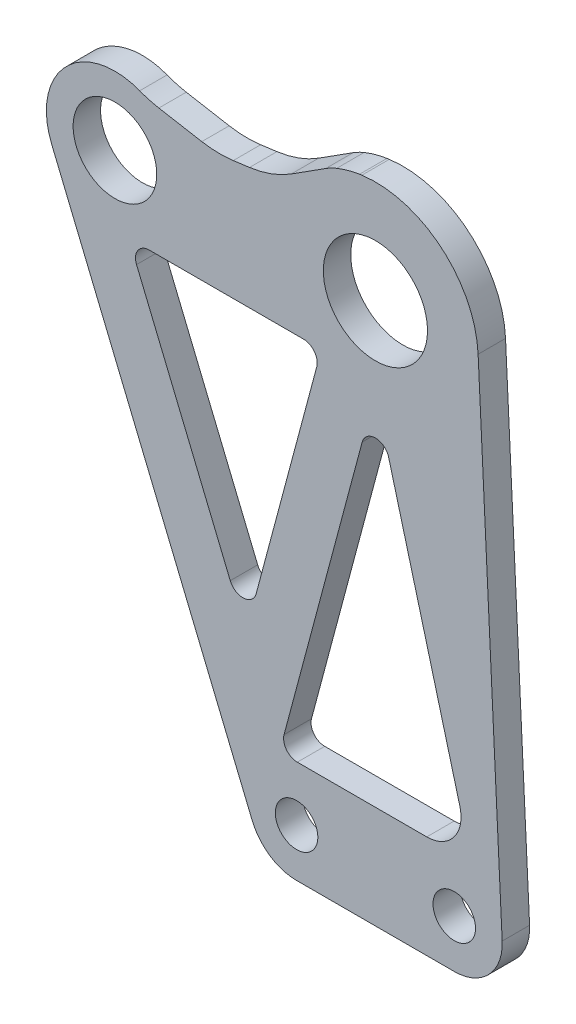
ISO-10303-21;
HEADER;
FILE_DESCRIPTION(('STEP AP214'),'2;1');
FILE_NAME('part.step','',(''),(''),'','','');
FILE_SCHEMA(('AUTOMOTIVE_DESIGN { 1 0 10303 214 1 1 1 1 }'));
ENDSEC;
DATA;
#1=APPLICATION_CONTEXT('core data for automotive mechanical design processes');
#2=APPLICATION_PROTOCOL_DEFINITION('international standard','automotive_design',2000,#1);
#3=PRODUCT_CONTEXT('',#1,'mechanical');
#4=PRODUCT('Part','Part','',(#3));
#5=PRODUCT_RELATED_PRODUCT_CATEGORY('part','',(#4));
#6=PRODUCT_DEFINITION_FORMATION('','',#4);
#7=PRODUCT_DEFINITION_CONTEXT('part definition',#1,'design');
#8=PRODUCT_DEFINITION('design','',#6,#7);
#9=PRODUCT_DEFINITION_SHAPE('','',#8);
#10=(LENGTH_UNIT() NAMED_UNIT(*) SI_UNIT(.MILLI.,.METRE.));
#11=(NAMED_UNIT(*) PLANE_ANGLE_UNIT() SI_UNIT($,.RADIAN.));
#12=(NAMED_UNIT(*) SI_UNIT($,.STERADIAN.) SOLID_ANGLE_UNIT());
#13=UNCERTAINTY_MEASURE_WITH_UNIT(LENGTH_MEASURE(1.E-05),#10,'distance_accuracy_value','');
#14=(GEOMETRIC_REPRESENTATION_CONTEXT(3) GLOBAL_UNCERTAINTY_ASSIGNED_CONTEXT((#13)) GLOBAL_UNIT_ASSIGNED_CONTEXT((#10,
#11,#12)) REPRESENTATION_CONTEXT('',''));
#15=CARTESIAN_POINT('',(0.,0.,0.));
#16=DIRECTION('',(0.,0.,1.));
#17=DIRECTION('',(1.,0.,0.));
#18=AXIS2_PLACEMENT_3D('',#15,#16,#17);
#19=CARTESIAN_POINT('',(-11.5,0.,4.));
#20=DIRECTION('',(0.,0.,1.));
#21=DIRECTION('',(1.,0.,0.));
#22=AXIS2_PLACEMENT_3D('',#19,#20,#21);
#23=PLANE('',#22);
#24=CARTESIAN_POINT('',(0.,72.,4.));
#25=DIRECTION('',(0.,0.,-1.));
#26=DIRECTION('',(1.,0.,0.));
#27=AXIS2_PLACEMENT_3D('',#24,#25,#26);
#28=CIRCLE('',#27,15.0037978079195);
#29=CARTESIAN_POINT('',(-5.64922242854932,85.899648722673,4.));
#30=VERTEX_POINT('',#29);
#31=CARTESIAN_POINT('',(-2.30831216147039,86.8251692612981,4.));
#32=VERTEX_POINT('',#31);
#33=EDGE_CURVE('E222',#30,#32,#28,.T.);
#34=ORIENTED_EDGE('',*,*,#33,.F.);
#35=CARTESIAN_POINT('',(-1.88402744200566,76.6355617890726,4.));
#36=DIRECTION('',(0.,0.,1.));
#37=DIRECTION('',(1.,0.,0.));
#38=AXIS2_PLACEMENT_3D('',#35,#36,#37);
#39=CIRCLE('',#38,10.);
#40=CARTESIAN_POINT('',(-7.2590241365421,85.06820138375,4.));
#41=VERTEX_POINT('',#40);
#42=EDGE_CURVE('E60',#30,#41,#39,.T.);
#43=ORIENTED_EDGE('',*,*,#42,.T.);
#44=DIRECTION('',(-0.843263959467748,-0.537499669453643,0.));
#45=VECTOR('',#44,1.);
#46=CARTESIAN_POINT('',(-6.69836822430438,85.4255656041956,4.));
#47=LINE('',#46,#45);
#48=CARTESIAN_POINT('',(-12.2752986193333,81.8708088637486,4.));
#49=VERTEX_POINT('',#48);
#50=EDGE_CURVE('E358',#41,#49,#47,.T.);
#51=ORIENTED_EDGE('',*,*,#50,.T.);
#52=CARTESIAN_POINT('',(-20.3377936611379,94.5197682557648,4.));
#53=DIRECTION('',(0.,0.,1.));
#54=DIRECTION('',(1.,0.,0.));
#55=AXIS2_PLACEMENT_3D('',#52,#53,#54);
#56=CIRCLE('',#55,15.);
#57=CARTESIAN_POINT('',(-18.3641094506116,79.6501828332616,4.));
#58=VERTEX_POINT('',#57);
#59=EDGE_CURVE('E388',#49,#58,#56,.F.);
#60=ORIENTED_EDGE('',*,*,#59,.T.);
#61=DIRECTION('',(0.991305694833545,0.131578947368421,0.));
#62=VECTOR('',#61,1.);
#63=CARTESIAN_POINT('',(-30.0729355904217,78.0960355844104,4.));
#64=LINE('',#63,#62);
#65=CARTESIAN_POINT('',(-20.7373696980855,79.3351729560649,4.));
#66=VERTEX_POINT('',#65);
#67=EDGE_CURVE('E231',#66,#58,#64,.T.);
#68=ORIENTED_EDGE('',*,*,#67,.F.);
#69=CARTESIAN_POINT('',(-22.7110539086118,94.204758378568,4.));
#70=DIRECTION('',(0.,0.,1.));
#71=DIRECTION('',(1.,0.,0.));
#72=AXIS2_PLACEMENT_3D('',#69,#70,#71);
#73=CIRCLE('',#72,15.);
#74=CARTESIAN_POINT('',(-25.3278901931516,79.4347831632904,4.));
#75=VERTEX_POINT('',#74);
#76=EDGE_CURVE('E382',#66,#75,#73,.F.);
#77=ORIENTED_EDGE('',*,*,#76,.T.);
#78=DIRECTION('',(0.984665014351843,-0.174455752302656,0.));
#79=VECTOR('',#78,1.);
#80=CARTESIAN_POINT('',(-23.0403436682235,79.0294923850897,4.));
#81=LINE('',#80,#79);
#82=CARTESIAN_POINT('',(-31.5938049647919,80.5449321575353,4.));
#83=VERTEX_POINT('',#82);
#84=EDGE_CURVE('E352',#75,#83,#81,.F.);
#85=ORIENTED_EDGE('',*,*,#84,.T.);
#86=CARTESIAN_POINT('',(-28.976968680252,95.3149073728129,4.));
#87=DIRECTION('',(0.,0.,1.));
#88=DIRECTION('',(1.,0.,0.));
#89=AXIS2_PLACEMENT_3D('',#86,#87,#88);
#90=CIRCLE('',#89,15.);
#91=CARTESIAN_POINT('',(-34.3907874721008,81.3259629491252,4.));
#92=VERTEX_POINT('',#91);
#93=EDGE_CURVE('E380',#83,#92,#90,.F.);
#94=ORIENTED_EDGE('',*,*,#93,.T.);
#95=CARTESIAN_POINT('',(-38.,72.,4.));
#96=DIRECTION('',(0.,0.,1.));
#97=DIRECTION('',(1.,0.,0.));
#98=AXIS2_PLACEMENT_3D('',#95,#96,#97);
#99=CIRCLE('',#98,10.);
#100=CARTESIAN_POINT('',(-47.2423056586954,68.1816513895079,4.));
#101=VERTEX_POINT('',#100);
#102=EDGE_CURVE('E246',#92,#101,#99,.T.);
#103=ORIENTED_EDGE('',*,*,#102,.T.);
#104=DIRECTION('',(0.381834861049206,-0.924230565869542,0.));
#105=VECTOR('',#104,1.);
#106=CARTESIAN_POINT('',(-47.2423056586954,68.1816513895079,4.));
#107=LINE('',#106,#105);
#108=CARTESIAN_POINT('',(-17.9696139610868,-2.67284402734444,4.));
#109=VERTEX_POINT('',#108);
#110=EDGE_CURVE('E248',#101,#109,#107,.T.);
#111=ORIENTED_EDGE('',*,*,#110,.T.);
#112=CARTESIAN_POINT('',(-11.5,0.,4.));
#113=DIRECTION('',(0.,0.,1.));
#114=DIRECTION('',(1.,0.,0.));
#115=AXIS2_PLACEMENT_3D('',#112,#113,#114);
#116=CIRCLE('',#115,7.);
#117=CARTESIAN_POINT('',(-11.5,-7.,4.));
#118=VERTEX_POINT('',#117);
#119=EDGE_CURVE('E273',#109,#118,#116,.T.);
#120=ORIENTED_EDGE('',*,*,#119,.T.);
#121=DIRECTION('',(1.,0.,0.));
#122=VECTOR('',#121,1.);
#123=CARTESIAN_POINT('',(-11.5,-7.,4.));
#124=LINE('',#123,#122);
#125=CARTESIAN_POINT('',(11.5,-7.,4.));
#126=VERTEX_POINT('',#125);
#127=EDGE_CURVE('E470',#118,#126,#124,.T.);
#128=ORIENTED_EDGE('',*,*,#127,.T.);
#129=CARTESIAN_POINT('',(11.5,0.,4.));
#130=DIRECTION('',(0.,0.,1.));
#131=DIRECTION('',(1.,0.,0.));
#132=AXIS2_PLACEMENT_3D('',#129,#130,#131);
#133=CIRCLE('',#132,7.);
#134=CARTESIAN_POINT('',(18.4917881788084,0.338966167448567,4.));
#135=VERTEX_POINT('',#134);
#136=EDGE_CURVE('E472',#126,#135,#133,.T.);
#137=ORIENTED_EDGE('',*,*,#136,.T.);
#138=DIRECTION('',(-0.0484237382069382,0.998826882686918,0.));
#139=VECTOR('',#138,1.);
#140=CARTESIAN_POINT('',(14.9824032403038,72.7263560731041,4.));
#141=LINE('',#140,#139);
#142=CARTESIAN_POINT('',(14.9824032403038,72.7263560731041,4.));
#143=VERTEX_POINT('',#142);
#144=EDGE_CURVE('E250',#135,#143,#141,.T.);
#145=ORIENTED_EDGE('',*,*,#144,.T.);
#146=CARTESIAN_POINT('',(0.,72.,4.));
#147=DIRECTION('',(0.,0.,1.));
#148=DIRECTION('',(1.,0.,0.));
#149=AXIS2_PLACEMENT_3D('',#146,#147,#148);
#150=CIRCLE('',#149,15.);
#151=CARTESIAN_POINT('',(-1.97368421052632,86.8695854225032,4.));
#152=VERTEX_POINT('',#151);
#153=EDGE_CURVE('E244',#143,#152,#150,.T.);
#154=ORIENTED_EDGE('',*,*,#153,.T.);
#155=DIRECTION('',(-0.991305694833545,-0.131578947368421,0.));
#156=VECTOR('',#155,1.);
#157=CARTESIAN_POINT('',(-39.3157894736842,81.9130569483355,4.));
#158=LINE('',#157,#156);
#159=EDGE_CURVE('E237',#152,#32,#158,.T.);
#160=ORIENTED_EDGE('',*,*,#159,.T.);
#161=EDGE_LOOP('',(#34,#43,#51,#60,#68,#77,#85,#94,#103,#111,#120,#128,#137,#145,#154,#160));
#162=FACE_BOUND('',#161,.T.);
#163=DIRECTION('',(0.381834861049206,-0.924230565869542,0.));
#164=VECTOR('',#163,1.);
#165=CARTESIAN_POINT('',(-18.9198788010047,20.5787359523555,4.));
#166=LINE('',#165,#164);
#167=CARTESIAN_POINT('',(-34.8494901072863,59.1363302779016,4.));
#168=VERTEX_POINT('',#167);
#169=CARTESIAN_POINT('',(-21.1756535351046,26.0388344704495,4.));
#170=VERTEX_POINT('',#169);
#171=EDGE_CURVE('E409',#168,#170,#166,.T.);
#172=ORIENTED_EDGE('',*,*,#171,.F.);
#173=CARTESIAN_POINT('',(-33.0010289755473,59.9,4.));
#174=DIRECTION('',(0.,0.,1.));
#175=DIRECTION('',(1.,0.,0.));
#176=AXIS2_PLACEMENT_3D('',#173,#174,#175);
#177=CIRCLE('',#176,2.);
#178=CARTESIAN_POINT('',(-33.0010289755473,61.9,4.));
#179=VERTEX_POINT('',#178);
#180=EDGE_CURVE('E323',#168,#179,#177,.F.);
#181=ORIENTED_EDGE('',*,*,#180,.T.);
#182=DIRECTION('',(-1.,0.,0.));
#183=VECTOR('',#182,1.);
#184=CARTESIAN_POINT('',(-35.9912673686027,61.9,4.));
#185=LINE('',#184,#183);
#186=CARTESIAN_POINT('',(-10.4843500120616,61.9,4.));
#187=VERTEX_POINT('',#186);
#188=EDGE_CURVE('E419',#187,#179,#185,.T.);
#189=ORIENTED_EDGE('',*,*,#188,.F.);
#190=CARTESIAN_POINT('',(-10.4843500120616,59.9,4.));
#191=DIRECTION('',(0.,0.,1.));
#192=DIRECTION('',(1.,0.,0.));
#193=AXIS2_PLACEMENT_3D('',#190,#191,#192);
#194=CIRCLE('',#193,2.);
#195=CARTESIAN_POINT('',(-8.55212516101198,59.3837567191852,4.));
#196=VERTEX_POINT('',#195);
#197=EDGE_CURVE('E319',#187,#196,#194,.F.);
#198=ORIENTED_EDGE('',*,*,#197,.T.);
#199=DIRECTION('',(0.258121640407387,0.966112425524793,0.));
#200=VECTOR('',#199,1.);
#201=CARTESIAN_POINT('',(-7.87984642186299,61.9,4.));
#202=LINE('',#201,#200);
#203=CARTESIAN_POINT('',(-17.394967552316,26.2862609117332,4.));
#204=VERTEX_POINT('',#203);
#205=EDGE_CURVE('E412',#204,#196,#202,.T.);
#206=ORIENTED_EDGE('',*,*,#205,.F.);
#207=CARTESIAN_POINT('',(-19.3271924033655,26.8025041925479,4.));
#208=DIRECTION('',(0.,0.,1.));
#209=DIRECTION('',(1.,0.,0.));
#210=AXIS2_PLACEMENT_3D('',#207,#208,#209);
#211=CIRCLE('',#210,2.);
#212=EDGE_CURVE('E327',#204,#170,#211,.F.);
#213=ORIENTED_EDGE('',*,*,#212,.T.);
#214=EDGE_LOOP('',(#172,#181,#189,#198,#206,#213));
#215=FACE_BOUND('',#214,.T.);
#216=DIRECTION('',(-0.258121640407388,0.966112425524793,0.));
#217=VECTOR('',#216,1.);
#218=CARTESIAN_POINT('',(14.,8.00000000000001,4.));
#219=LINE('',#218,#217);
#220=CARTESIAN_POINT('',(12.3193031521275,14.290608202037,4.));
#221=VERTEX_POINT('',#220);
#222=CARTESIAN_POINT('',(1.93222485104958,53.167958414643,4.));
#223=VERTEX_POINT('',#222);
#224=EDGE_CURVE('E424',#221,#223,#219,.T.);
#225=ORIENTED_EDGE('',*,*,#224,.F.);
#226=CARTESIAN_POINT('',(7.48874102450357,13.,4.));
#227=DIRECTION('',(0.,0.,1.));
#228=DIRECTION('',(1.,0.,0.));
#229=AXIS2_PLACEMENT_3D('',#226,#227,#228);
#230=CIRCLE('',#229,5.);
#231=CARTESIAN_POINT('',(7.48874102450357,8.00000000000001,4.));
#232=VERTEX_POINT('',#231);
#233=EDGE_CURVE('E345',#221,#232,#230,.F.);
#234=ORIENTED_EDGE('',*,*,#233,.T.);
#235=DIRECTION('',(1.,0.,0.));
#236=VECTOR('',#235,1.);
#237=CARTESIAN_POINT('',(-14.,8.00000000000001,4.));
#238=LINE('',#237,#236);
#239=CARTESIAN_POINT('',(-11.3954964098014,8.00000000000001,4.));
#240=VERTEX_POINT('',#239);
#241=EDGE_CURVE('E433',#240,#232,#238,.T.);
#242=ORIENTED_EDGE('',*,*,#241,.F.);
#243=CARTESIAN_POINT('',(-11.3954964098014,10.,4.));
#244=DIRECTION('',(0.,0.,1.));
#245=DIRECTION('',(1.,0.,0.));
#246=AXIS2_PLACEMENT_3D('',#243,#244,#245);
#247=CIRCLE('',#246,2.);
#248=CARTESIAN_POINT('',(-13.327721260851,10.5162432808148,4.));
#249=VERTEX_POINT('',#248);
#250=EDGE_CURVE('E331',#240,#249,#247,.F.);
#251=ORIENTED_EDGE('',*,*,#250,.T.);
#252=DIRECTION('',(-0.258121640407387,-0.966112425524793,0.));
#253=VECTOR('',#252,1.);
#254=CARTESIAN_POINT('',(0.,60.4,4.));
#255=LINE('',#254,#253);
#256=CARTESIAN_POINT('',(-1.93222485104959,53.167958414643,4.));
#257=VERTEX_POINT('',#256);
#258=EDGE_CURVE('E441',#257,#249,#255,.T.);
#259=ORIENTED_EDGE('',*,*,#258,.F.);
#260=CARTESIAN_POINT('',(0.,52.6517151338282,4.));
#261=DIRECTION('',(0.,0.,1.));
#262=DIRECTION('',(1.,0.,0.));
#263=AXIS2_PLACEMENT_3D('',#260,#261,#262);
#264=CIRCLE('',#263,2.);
#265=EDGE_CURVE('E335',#257,#223,#264,.F.);
#266=ORIENTED_EDGE('',*,*,#265,.T.);
#267=EDGE_LOOP('',(#225,#234,#242,#251,#259,#266));
#268=FACE_BOUND('',#267,.T.);
#269=CARTESIAN_POINT('',(0.,72.,4.));
#270=DIRECTION('',(0.,0.,1.));
#271=DIRECTION('',(1.,0.,0.));
#272=AXIS2_PLACEMENT_3D('',#269,#270,#271);
#273=CIRCLE('',#272,7.6);
#274=CARTESIAN_POINT('',(7.6,72.,4.));
#275=VERTEX_POINT('',#274);
#276=EDGE_CURVE('E452',#275,#275,#273,.T.);
#277=ORIENTED_EDGE('',*,*,#276,.F.);
#278=EDGE_LOOP('',(#277));
#279=FACE_BOUND('',#278,.T.);
#280=CARTESIAN_POINT('',(-11.5,0.,4.));
#281=DIRECTION('',(0.,0.,1.));
#282=DIRECTION('',(1.,0.,0.));
#283=AXIS2_PLACEMENT_3D('',#280,#281,#282);
#284=CIRCLE('',#283,3.1);
#285=CARTESIAN_POINT('',(-8.4,0.,4.));
#286=VERTEX_POINT('',#285);
#287=EDGE_CURVE('E260',#286,#286,#284,.T.);
#288=ORIENTED_EDGE('',*,*,#287,.F.);
#289=EDGE_LOOP('',(#288));
#290=FACE_BOUND('',#289,.T.);
#291=CARTESIAN_POINT('',(11.5,0.,4.));
#292=DIRECTION('',(0.,0.,1.));
#293=DIRECTION('',(1.,0.,0.));
#294=AXIS2_PLACEMENT_3D('',#291,#292,#293);
#295=CIRCLE('',#294,3.1);
#296=CARTESIAN_POINT('',(14.6,0.,4.));
#297=VERTEX_POINT('',#296);
#298=EDGE_CURVE('E458',#297,#297,#295,.T.);
#299=ORIENTED_EDGE('',*,*,#298,.F.);
#300=EDGE_LOOP('',(#299));
#301=FACE_BOUND('',#300,.T.);
#302=CARTESIAN_POINT('',(-38.,72.,4.));
#303=DIRECTION('',(0.,0.,1.));
#304=DIRECTION('',(1.,0.,0.));
#305=AXIS2_PLACEMENT_3D('',#302,#303,#304);
#306=CIRCLE('',#305,6.1);
#307=CARTESIAN_POINT('',(-31.9,72.,4.));
#308=VERTEX_POINT('',#307);
#309=EDGE_CURVE('E446',#308,#308,#306,.T.);
#310=ORIENTED_EDGE('',*,*,#309,.F.);
#311=EDGE_LOOP('',(#310));
#312=FACE_BOUND('',#311,.T.);
#313=ADVANCED_FACE('F38',(#162,#215,#268,#279,#290,#301,#312),#23,.T.);
#314=CARTESIAN_POINT('',(-11.5,0.,0.));
#315=DIRECTION('',(0.,0.,1.));
#316=DIRECTION('',(1.,0.,0.));
#317=AXIS2_PLACEMENT_3D('',#314,#315,#316);
#318=PLANE('',#317);
#319=DIRECTION('',(0.258121640407387,0.966112425524793,0.));
#320=VECTOR('',#319,1.);
#321=CARTESIAN_POINT('',(-7.87984642186299,61.9,0.));
#322=LINE('',#321,#320);
#323=CARTESIAN_POINT('',(-17.394967552316,26.2862609117332,0.));
#324=VERTEX_POINT('',#323);
#325=CARTESIAN_POINT('',(-8.55212516101198,59.3837567191852,0.));
#326=VERTEX_POINT('',#325);
#327=EDGE_CURVE('E418',#324,#326,#322,.T.);
#328=ORIENTED_EDGE('',*,*,#327,.T.);
#329=CARTESIAN_POINT('',(-10.4843500120616,59.9,0.));
#330=DIRECTION('',(0.,0.,1.));
#331=DIRECTION('',(1.,0.,0.));
#332=AXIS2_PLACEMENT_3D('',#329,#330,#331);
#333=CIRCLE('',#332,2.);
#334=CARTESIAN_POINT('',(-10.4843500120616,61.9,0.));
#335=VERTEX_POINT('',#334);
#336=EDGE_CURVE('E321',#326,#335,#333,.T.);
#337=ORIENTED_EDGE('',*,*,#336,.T.);
#338=DIRECTION('',(-1.,0.,0.));
#339=VECTOR('',#338,1.);
#340=CARTESIAN_POINT('',(-35.9912673686027,61.9,0.));
#341=LINE('',#340,#339);
#342=CARTESIAN_POINT('',(-33.0010289755473,61.9,0.));
#343=VERTEX_POINT('',#342);
#344=EDGE_CURVE('E422',#335,#343,#341,.T.);
#345=ORIENTED_EDGE('',*,*,#344,.T.);
#346=CARTESIAN_POINT('',(-33.0010289755473,59.9,0.));
#347=DIRECTION('',(0.,0.,1.));
#348=DIRECTION('',(1.,0.,0.));
#349=AXIS2_PLACEMENT_3D('',#346,#347,#348);
#350=CIRCLE('',#349,2.);
#351=CARTESIAN_POINT('',(-34.8494901072863,59.1363302779016,0.));
#352=VERTEX_POINT('',#351);
#353=EDGE_CURVE('E325',#343,#352,#350,.T.);
#354=ORIENTED_EDGE('',*,*,#353,.T.);
#355=DIRECTION('',(0.381834861049206,-0.924230565869542,0.));
#356=VECTOR('',#355,1.);
#357=CARTESIAN_POINT('',(-18.9198788010047,20.5787359523555,0.));
#358=LINE('',#357,#356);
#359=CARTESIAN_POINT('',(-21.1756535351046,26.0388344704495,0.));
#360=VERTEX_POINT('',#359);
#361=EDGE_CURVE('E415',#352,#360,#358,.T.);
#362=ORIENTED_EDGE('',*,*,#361,.T.);
#363=CARTESIAN_POINT('',(-19.3271924033655,26.8025041925479,0.));
#364=DIRECTION('',(0.,0.,1.));
#365=DIRECTION('',(1.,0.,0.));
#366=AXIS2_PLACEMENT_3D('',#363,#364,#365);
#367=CIRCLE('',#366,2.);
#368=EDGE_CURVE('E329',#360,#324,#367,.T.);
#369=ORIENTED_EDGE('',*,*,#368,.T.);
#370=EDGE_LOOP('',(#328,#337,#345,#354,#362,#369));
#371=FACE_BOUND('',#370,.T.);
#372=DIRECTION('',(-0.258121640407387,-0.966112425524793,0.));
#373=VECTOR('',#372,1.);
#374=CARTESIAN_POINT('',(0.,60.4,0.));
#375=LINE('',#374,#373);
#376=CARTESIAN_POINT('',(-1.93222485104959,53.167958414643,0.));
#377=VERTEX_POINT('',#376);
#378=CARTESIAN_POINT('',(-13.327721260851,10.5162432808148,0.));
#379=VERTEX_POINT('',#378);
#380=EDGE_CURVE('E432',#377,#379,#375,.T.);
#381=ORIENTED_EDGE('',*,*,#380,.T.);
#382=CARTESIAN_POINT('',(-11.3954964098014,10.,0.));
#383=DIRECTION('',(0.,0.,1.));
#384=DIRECTION('',(1.,0.,0.));
#385=AXIS2_PLACEMENT_3D('',#382,#383,#384);
#386=CIRCLE('',#385,2.);
#387=CARTESIAN_POINT('',(-11.3954964098014,8.00000000000001,0.));
#388=VERTEX_POINT('',#387);
#389=EDGE_CURVE('E333',#379,#388,#386,.T.);
#390=ORIENTED_EDGE('',*,*,#389,.T.);
#391=DIRECTION('',(1.,0.,0.));
#392=VECTOR('',#391,1.);
#393=CARTESIAN_POINT('',(-14.,8.00000000000001,0.));
#394=LINE('',#393,#392);
#395=CARTESIAN_POINT('',(7.48874102450357,8.00000000000001,0.));
#396=VERTEX_POINT('',#395);
#397=EDGE_CURVE('E436',#388,#396,#394,.T.);
#398=ORIENTED_EDGE('',*,*,#397,.T.);
#399=CARTESIAN_POINT('',(7.48874102450357,13.,0.));
#400=DIRECTION('',(0.,0.,1.));
#401=DIRECTION('',(1.,0.,0.));
#402=AXIS2_PLACEMENT_3D('',#399,#400,#401);
#403=CIRCLE('',#402,5.);
#404=CARTESIAN_POINT('',(12.3193031521275,14.290608202037,0.));
#405=VERTEX_POINT('',#404);
#406=EDGE_CURVE('E347',#396,#405,#403,.T.);
#407=ORIENTED_EDGE('',*,*,#406,.T.);
#408=DIRECTION('',(-0.258121640407388,0.966112425524793,0.));
#409=VECTOR('',#408,1.);
#410=CARTESIAN_POINT('',(14.,8.00000000000001,0.));
#411=LINE('',#410,#409);
#412=CARTESIAN_POINT('',(1.93222485104958,53.167958414643,0.));
#413=VERTEX_POINT('',#412);
#414=EDGE_CURVE('E430',#405,#413,#411,.T.);
#415=ORIENTED_EDGE('',*,*,#414,.T.);
#416=CARTESIAN_POINT('',(0.,52.6517151338282,0.));
#417=DIRECTION('',(0.,0.,1.));
#418=DIRECTION('',(1.,0.,0.));
#419=AXIS2_PLACEMENT_3D('',#416,#417,#418);
#420=CIRCLE('',#419,2.);
#421=EDGE_CURVE('E338',#413,#377,#420,.T.);
#422=ORIENTED_EDGE('',*,*,#421,.T.);
#423=EDGE_LOOP('',(#381,#390,#398,#407,#415,#422));
#424=FACE_BOUND('',#423,.T.);
#425=DIRECTION('',(0.843263959467748,0.537499669453643,0.));
#426=VECTOR('',#425,1.);
#427=CARTESIAN_POINT('',(-48.8322680861663,58.5692568597331,0.));
#428=LINE('',#427,#426);
#429=CARTESIAN_POINT('',(-12.2752986193333,81.8708088637485,0.));
#430=VERTEX_POINT('',#429);
#431=CARTESIAN_POINT('',(-7.2590241365421,85.06820138375,0.));
#432=VERTEX_POINT('',#431);
#433=EDGE_CURVE('E360',#430,#432,#428,.T.);
#434=ORIENTED_EDGE('',*,*,#433,.T.);
#435=CARTESIAN_POINT('',(-1.88402744200566,76.6355617890726,0.));
#436=DIRECTION('',(0.,0.,1.));
#437=DIRECTION('',(1.,0.,0.));
#438=AXIS2_PLACEMENT_3D('',#435,#436,#437);
#439=CIRCLE('',#438,10.);
#440=CARTESIAN_POINT('',(-5.64922242854932,85.899648722673,0.));
#441=VERTEX_POINT('',#440);
#442=EDGE_CURVE('E11',#432,#441,#439,.F.);
#443=ORIENTED_EDGE('',*,*,#442,.T.);
#444=CARTESIAN_POINT('',(0.,72.,0.));
#445=DIRECTION('',(0.,0.,1.));
#446=DIRECTION('',(1.,0.,0.));
#447=AXIS2_PLACEMENT_3D('',#444,#445,#446);
#448=CIRCLE('',#447,15.0037978079195);
#449=CARTESIAN_POINT('',(-2.30831216147039,86.8251692612981,0.));
#450=VERTEX_POINT('',#449);
#451=EDGE_CURVE('E240',#441,#450,#448,.F.);
#452=ORIENTED_EDGE('',*,*,#451,.T.);
#453=DIRECTION('',(-0.991305694833545,-0.131578947368421,0.));
#454=VECTOR('',#453,1.);
#455=CARTESIAN_POINT('',(-39.3157894736842,81.9130569483355,0.));
#456=LINE('',#455,#454);
#457=CARTESIAN_POINT('',(-1.97368421052632,86.8695854225032,0.));
#458=VERTEX_POINT('',#457);
#459=EDGE_CURVE('E239',#458,#450,#456,.T.);
#460=ORIENTED_EDGE('',*,*,#459,.F.);
#461=CARTESIAN_POINT('',(0.,72.,0.));
#462=DIRECTION('',(0.,0.,1.));
#463=DIRECTION('',(1.,0.,0.));
#464=AXIS2_PLACEMENT_3D('',#461,#462,#463);
#465=CIRCLE('',#464,15.);
#466=CARTESIAN_POINT('',(14.9824032403038,72.7263560731041,0.));
#467=VERTEX_POINT('',#466);
#468=EDGE_CURVE('E266',#467,#458,#465,.T.);
#469=ORIENTED_EDGE('',*,*,#468,.F.);
#470=DIRECTION('',(-0.0484237382069382,0.998826882686918,0.));
#471=VECTOR('',#470,1.);
#472=CARTESIAN_POINT('',(14.9824032403038,72.7263560731041,0.));
#473=LINE('',#472,#471);
#474=CARTESIAN_POINT('',(18.4917881788084,0.338966167448567,0.));
#475=VERTEX_POINT('',#474);
#476=EDGE_CURVE('E264',#475,#467,#473,.T.);
#477=ORIENTED_EDGE('',*,*,#476,.F.);
#478=CARTESIAN_POINT('',(11.5,0.,0.));
#479=DIRECTION('',(0.,0.,1.));
#480=DIRECTION('',(1.,0.,0.));
#481=AXIS2_PLACEMENT_3D('',#478,#479,#480);
#482=CIRCLE('',#481,7.);
#483=CARTESIAN_POINT('',(11.5,-7.,0.));
#484=VERTEX_POINT('',#483);
#485=EDGE_CURVE('E262',#484,#475,#482,.T.);
#486=ORIENTED_EDGE('',*,*,#485,.F.);
#487=DIRECTION('',(1.,0.,0.));
#488=VECTOR('',#487,1.);
#489=CARTESIAN_POINT('',(-11.5,-7.,0.));
#490=LINE('',#489,#488);
#491=CARTESIAN_POINT('',(-11.5,-7.,0.));
#492=VERTEX_POINT('',#491);
#493=EDGE_CURVE('E259',#492,#484,#490,.T.);
#494=ORIENTED_EDGE('',*,*,#493,.F.);
#495=CARTESIAN_POINT('',(-11.5,0.,0.));
#496=DIRECTION('',(0.,0.,1.));
#497=DIRECTION('',(1.,0.,0.));
#498=AXIS2_PLACEMENT_3D('',#495,#496,#497);
#499=CIRCLE('',#498,7.);
#500=CARTESIAN_POINT('',(-17.9696139610868,-2.67284402734444,0.));
#501=VERTEX_POINT('',#500);
#502=EDGE_CURVE('E256',#501,#492,#499,.T.);
#503=ORIENTED_EDGE('',*,*,#502,.F.);
#504=DIRECTION('',(0.381834861049206,-0.924230565869542,0.));
#505=VECTOR('',#504,1.);
#506=CARTESIAN_POINT('',(-47.2423056586954,68.1816513895079,0.));
#507=LINE('',#506,#505);
#508=CARTESIAN_POINT('',(-47.2423056586954,68.1816513895079,0.));
#509=VERTEX_POINT('',#508);
#510=EDGE_CURVE('E271',#509,#501,#507,.T.);
#511=ORIENTED_EDGE('',*,*,#510,.F.);
#512=CARTESIAN_POINT('',(-38.,72.,0.));
#513=DIRECTION('',(0.,0.,1.));
#514=DIRECTION('',(1.,0.,0.));
#515=AXIS2_PLACEMENT_3D('',#512,#513,#514);
#516=CIRCLE('',#515,10.);
#517=CARTESIAN_POINT('',(-34.3907874721008,81.3259629491252,0.));
#518=VERTEX_POINT('',#517);
#519=EDGE_CURVE('E269',#518,#509,#516,.T.);
#520=ORIENTED_EDGE('',*,*,#519,.F.);
#521=CARTESIAN_POINT('',(-28.976968680252,95.3149073728129,0.));
#522=DIRECTION('',(0.,0.,1.));
#523=DIRECTION('',(1.,0.,0.));
#524=AXIS2_PLACEMENT_3D('',#521,#522,#523);
#525=CIRCLE('',#524,15.);
#526=CARTESIAN_POINT('',(-31.5938049647919,80.5449321575353,0.));
#527=VERTEX_POINT('',#526);
#528=EDGE_CURVE('E378',#518,#527,#525,.T.);
#529=ORIENTED_EDGE('',*,*,#528,.T.);
#530=DIRECTION('',(-0.984665014351843,0.174455752302656,0.));
#531=VECTOR('',#530,1.);
#532=CARTESIAN_POINT('',(1.72449564644871,74.6418391118195,0.));
#533=LINE('',#532,#531);
#534=CARTESIAN_POINT('',(-25.3278901931516,79.4347831632904,0.));
#535=VERTEX_POINT('',#534);
#536=EDGE_CURVE('E355',#527,#535,#533,.F.);
#537=ORIENTED_EDGE('',*,*,#536,.T.);
#538=CARTESIAN_POINT('',(-22.7110539086118,94.204758378568,0.));
#539=DIRECTION('',(0.,0.,1.));
#540=DIRECTION('',(1.,0.,0.));
#541=AXIS2_PLACEMENT_3D('',#538,#539,#540);
#542=CIRCLE('',#541,15.);
#543=CARTESIAN_POINT('',(-20.7373696980855,79.3351729560649,0.));
#544=VERTEX_POINT('',#543);
#545=EDGE_CURVE('E384',#535,#544,#542,.T.);
#546=ORIENTED_EDGE('',*,*,#545,.T.);
#547=DIRECTION('',(0.991305694833545,0.131578947368421,0.));
#548=VECTOR('',#547,1.);
#549=CARTESIAN_POINT('',(-22.0080068596419,79.1665175139786,0.));
#550=LINE('',#549,#548);
#551=CARTESIAN_POINT('',(-18.3641094506116,79.6501828332616,0.));
#552=VERTEX_POINT('',#551);
#553=EDGE_CURVE('E349',#544,#552,#550,.T.);
#554=ORIENTED_EDGE('',*,*,#553,.T.);
#555=CARTESIAN_POINT('',(-20.3377936611379,94.5197682557648,0.));
#556=DIRECTION('',(0.,0.,1.));
#557=DIRECTION('',(1.,0.,0.));
#558=AXIS2_PLACEMENT_3D('',#555,#556,#557);
#559=CIRCLE('',#558,15.);
#560=EDGE_CURVE('E386',#552,#430,#559,.T.);
#561=ORIENTED_EDGE('',*,*,#560,.T.);
#562=EDGE_LOOP('',(#434,#443,#452,#460,#469,#477,#486,#494,#503,#511,#520,#529,#537,#546,#554,#561));
#563=FACE_BOUND('',#562,.T.);
#564=CARTESIAN_POINT('',(-11.5,0.,0.));
#565=DIRECTION('',(0.,0.,1.));
#566=DIRECTION('',(1.,0.,0.));
#567=AXIS2_PLACEMENT_3D('',#564,#565,#566);
#568=CIRCLE('',#567,3.1);
#569=CARTESIAN_POINT('',(-8.4,0.,0.));
#570=VERTEX_POINT('',#569);
#571=EDGE_CURVE('E461',#570,#570,#568,.T.);
#572=ORIENTED_EDGE('',*,*,#571,.T.);
#573=EDGE_LOOP('',(#572));
#574=FACE_BOUND('',#573,.T.);
#575=CARTESIAN_POINT('',(11.5,0.,0.));
#576=DIRECTION('',(0.,0.,1.));
#577=DIRECTION('',(1.,0.,0.));
#578=AXIS2_PLACEMENT_3D('',#575,#576,#577);
#579=CIRCLE('',#578,3.1);
#580=CARTESIAN_POINT('',(14.6,0.,0.));
#581=VERTEX_POINT('',#580);
#582=EDGE_CURVE('E455',#581,#581,#579,.T.);
#583=ORIENTED_EDGE('',*,*,#582,.T.);
#584=EDGE_LOOP('',(#583));
#585=FACE_BOUND('',#584,.T.);
#586=CARTESIAN_POINT('',(0.,72.,0.));
#587=DIRECTION('',(0.,0.,1.));
#588=DIRECTION('',(1.,0.,0.));
#589=AXIS2_PLACEMENT_3D('',#586,#587,#588);
#590=CIRCLE('',#589,7.6);
#591=CARTESIAN_POINT('',(7.6,72.,0.));
#592=VERTEX_POINT('',#591);
#593=EDGE_CURVE('E449',#592,#592,#590,.T.);
#594=ORIENTED_EDGE('',*,*,#593,.T.);
#595=EDGE_LOOP('',(#594));
#596=FACE_BOUND('',#595,.T.);
#597=CARTESIAN_POINT('',(-38.,72.,0.));
#598=DIRECTION('',(0.,0.,1.));
#599=DIRECTION('',(1.,0.,0.));
#600=AXIS2_PLACEMENT_3D('',#597,#598,#599);
#601=CIRCLE('',#600,6.1);
#602=CARTESIAN_POINT('',(-31.9,72.,0.));
#603=VERTEX_POINT('',#602);
#604=EDGE_CURVE('E439',#603,#603,#601,.T.);
#605=ORIENTED_EDGE('',*,*,#604,.T.);
#606=EDGE_LOOP('',(#605));
#607=FACE_BOUND('',#606,.T.);
#608=ADVANCED_FACE('F404',(#371,#424,#563,#574,#585,#596,#607),#318,.F.);
#609=CARTESIAN_POINT('',(-11.5,0.,4.));
#610=DIRECTION('',(0.,0.,-1.));
#611=DIRECTION('',(-1.,0.,0.));
#612=AXIS2_PLACEMENT_3D('',#609,#610,#611);
#613=CYLINDRICAL_SURFACE('',#612,7.);
#614=ORIENTED_EDGE('',*,*,#502,.T.);
#615=DIRECTION('',(0.,0.,-1.));
#616=VECTOR('',#615,1.);
#617=CARTESIAN_POINT('',(-11.5,-7.,4.));
#618=LINE('',#617,#616);
#619=EDGE_CURVE('E290',#118,#492,#618,.T.);
#620=ORIENTED_EDGE('',*,*,#619,.F.);
#621=ORIENTED_EDGE('',*,*,#119,.F.);
#622=DIRECTION('',(0.,0.,-1.));
#623=VECTOR('',#622,1.);
#624=CARTESIAN_POINT('',(-17.9696139610868,-2.67284402734444,4.));
#625=LINE('',#624,#623);
#626=EDGE_CURVE('E255',#109,#501,#625,.T.);
#627=ORIENTED_EDGE('',*,*,#626,.T.);
#628=EDGE_LOOP('',(#614,#620,#621,#627));
#629=FACE_BOUND('',#628,.T.);
#630=ADVANCED_FACE('F493',(#629),#613,.T.);
#631=CARTESIAN_POINT('',(-11.5,-7.,4.));
#632=DIRECTION('',(0.,1.,0.));
#633=DIRECTION('',(-1.,0.,0.));
#634=AXIS2_PLACEMENT_3D('',#631,#632,#633);
#635=PLANE('',#634);
#636=ORIENTED_EDGE('',*,*,#493,.T.);
#637=DIRECTION('',(0.,0.,-1.));
#638=VECTOR('',#637,1.);
#639=CARTESIAN_POINT('',(11.5,-7.,4.));
#640=LINE('',#639,#638);
#641=EDGE_CURVE('E287',#126,#484,#640,.T.);
#642=ORIENTED_EDGE('',*,*,#641,.F.);
#643=ORIENTED_EDGE('',*,*,#127,.F.);
#644=ORIENTED_EDGE('',*,*,#619,.T.);
#645=EDGE_LOOP('',(#636,#642,#643,#644));
#646=FACE_BOUND('',#645,.T.);
#647=ADVANCED_FACE('F489',(#646),#635,.F.);
#648=CARTESIAN_POINT('',(11.5,0.,4.));
#649=DIRECTION('',(0.,0.,-1.));
#650=DIRECTION('',(-1.,0.,0.));
#651=AXIS2_PLACEMENT_3D('',#648,#649,#650);
#652=CYLINDRICAL_SURFACE('',#651,7.);
#653=ORIENTED_EDGE('',*,*,#485,.T.);
#654=DIRECTION('',(0.,0.,-1.));
#655=VECTOR('',#654,1.);
#656=CARTESIAN_POINT('',(18.4917881788084,0.338966167448567,4.));
#657=LINE('',#656,#655);
#658=EDGE_CURVE('E284',#135,#475,#657,.T.);
#659=ORIENTED_EDGE('',*,*,#658,.F.);
#660=ORIENTED_EDGE('',*,*,#136,.F.);
#661=ORIENTED_EDGE('',*,*,#641,.T.);
#662=EDGE_LOOP('',(#653,#659,#660,#661));
#663=FACE_BOUND('',#662,.T.);
#664=ADVANCED_FACE('F486',(#663),#652,.T.);
#665=CARTESIAN_POINT('',(14.9824032403038,72.7263560731041,4.));
#666=DIRECTION('',(-0.998826882686918,-0.0484237382069382,0.));
#667=DIRECTION('',(0.0484237382069382,-0.998826882686918,0.));
#668=AXIS2_PLACEMENT_3D('',#665,#666,#667);
#669=PLANE('',#668);
#670=ORIENTED_EDGE('',*,*,#476,.T.);
#671=DIRECTION('',(0.,0.,-1.));
#672=VECTOR('',#671,1.);
#673=CARTESIAN_POINT('',(14.9824032403038,72.7263560731041,4.));
#674=LINE('',#673,#672);
#675=EDGE_CURVE('E281',#143,#467,#674,.T.);
#676=ORIENTED_EDGE('',*,*,#675,.F.);
#677=ORIENTED_EDGE('',*,*,#144,.F.);
#678=ORIENTED_EDGE('',*,*,#658,.T.);
#679=EDGE_LOOP('',(#670,#676,#677,#678));
#680=FACE_BOUND('',#679,.T.);
#681=ADVANCED_FACE('F478',(#680),#669,.F.);
#682=CARTESIAN_POINT('',(0.,72.,4.));
#683=DIRECTION('',(0.,0.,-1.));
#684=DIRECTION('',(-1.,0.,0.));
#685=AXIS2_PLACEMENT_3D('',#682,#683,#684);
#686=CYLINDRICAL_SURFACE('',#685,15.);
#687=ORIENTED_EDGE('',*,*,#468,.T.);
#688=DIRECTION('',(0.,0.,-1.));
#689=VECTOR('',#688,1.);
#690=CARTESIAN_POINT('',(-1.97368421052632,86.8695854225032,4.));
#691=LINE('',#690,#689);
#692=EDGE_CURVE('E279',#152,#458,#691,.T.);
#693=ORIENTED_EDGE('',*,*,#692,.F.);
#694=ORIENTED_EDGE('',*,*,#153,.F.);
#695=ORIENTED_EDGE('',*,*,#675,.T.);
#696=EDGE_LOOP('',(#687,#693,#694,#695));
#697=FACE_BOUND('',#696,.T.);
#698=ADVANCED_FACE('F482',(#697),#686,.T.);
#699=CARTESIAN_POINT('',(-39.3157894736842,81.9130569483355,4.));
#700=DIRECTION('',(0.131578947368421,-0.991305694833545,0.));
#701=DIRECTION('',(0.991305694833546,0.131578947368421,0.));
#702=AXIS2_PLACEMENT_3D('',#699,#700,#701);
#703=PLANE('',#702);
#704=ORIENTED_EDGE('',*,*,#459,.T.);
#705=DIRECTION('',(0.,0.,1.));
#706=VECTOR('',#705,1.);
#707=CARTESIAN_POINT('',(-2.30831216147039,86.8251692612981,-6.));
#708=LINE('',#707,#706);
#709=EDGE_CURVE('E226',#450,#32,#708,.T.);
#710=ORIENTED_EDGE('',*,*,#709,.T.);
#711=ORIENTED_EDGE('',*,*,#159,.F.);
#712=ORIENTED_EDGE('',*,*,#692,.T.);
#713=EDGE_LOOP('',(#704,#710,#711,#712));
#714=FACE_BOUND('',#713,.T.);
#715=ADVANCED_FACE('F235',(#714),#703,.F.);
#716=CARTESIAN_POINT('',(-38.,72.,4.));
#717=DIRECTION('',(0.,0.,-1.));
#718=DIRECTION('',(-1.,0.,0.));
#719=AXIS2_PLACEMENT_3D('',#716,#717,#718);
#720=CYLINDRICAL_SURFACE('',#719,10.);
#721=ORIENTED_EDGE('',*,*,#102,.F.);
#722=DIRECTION('',(0.,0.,-1.));
#723=VECTOR('',#722,1.);
#724=CARTESIAN_POINT('',(-34.3907874721008,81.3259629491252,4.));
#725=LINE('',#724,#723);
#726=EDGE_CURVE('E362',#92,#518,#725,.T.);
#727=ORIENTED_EDGE('',*,*,#726,.T.);
#728=ORIENTED_EDGE('',*,*,#519,.T.);
#729=DIRECTION('',(0.,0.,-1.));
#730=VECTOR('',#729,1.);
#731=CARTESIAN_POINT('',(-47.2423056586954,68.1816513895079,4.));
#732=LINE('',#731,#730);
#733=EDGE_CURVE('E276',#101,#509,#732,.T.);
#734=ORIENTED_EDGE('',*,*,#733,.F.);
#735=EDGE_LOOP('',(#721,#727,#728,#734));
#736=FACE_BOUND('',#735,.T.);
#737=ADVANCED_FACE('F503',(#736),#720,.T.);
#738=CARTESIAN_POINT('',(-47.2423056586954,68.1816513895079,4.));
#739=DIRECTION('',(0.924230565869542,0.381834861049206,0.));
#740=DIRECTION('',(-0.381834861049206,0.924230565869542,0.));
#741=AXIS2_PLACEMENT_3D('',#738,#739,#740);
#742=PLANE('',#741);
#743=ORIENTED_EDGE('',*,*,#510,.T.);
#744=ORIENTED_EDGE('',*,*,#626,.F.);
#745=ORIENTED_EDGE('',*,*,#110,.F.);
#746=ORIENTED_EDGE('',*,*,#733,.T.);
#747=EDGE_LOOP('',(#743,#744,#745,#746));
#748=FACE_BOUND('',#747,.T.);
#749=ADVANCED_FACE('F498',(#748),#742,.F.);
#750=CARTESIAN_POINT('',(-11.5,0.,4.));
#751=DIRECTION('',(0.,0.,-1.));
#752=DIRECTION('',(-1.,0.,0.));
#753=AXIS2_PLACEMENT_3D('',#750,#751,#752);
#754=CYLINDRICAL_SURFACE('',#753,3.1);
#755=ORIENTED_EDGE('',*,*,#287,.T.);
#756=EDGE_LOOP('',(#755));
#757=FACE_BOUND('',#756,.T.);
#758=ORIENTED_EDGE('',*,*,#571,.F.);
#759=EDGE_LOOP('',(#758));
#760=FACE_BOUND('',#759,.T.);
#761=ADVANCED_FACE('F532',(#757,#760),#754,.F.);
#762=CARTESIAN_POINT('',(11.5,0.,4.));
#763=DIRECTION('',(0.,0.,-1.));
#764=DIRECTION('',(-1.,0.,0.));
#765=AXIS2_PLACEMENT_3D('',#762,#763,#764);
#766=CYLINDRICAL_SURFACE('',#765,3.1);
#767=ORIENTED_EDGE('',*,*,#298,.T.);
#768=EDGE_LOOP('',(#767));
#769=FACE_BOUND('',#768,.T.);
#770=ORIENTED_EDGE('',*,*,#582,.F.);
#771=EDGE_LOOP('',(#770));
#772=FACE_BOUND('',#771,.T.);
#773=ADVANCED_FACE('F723',(#769,#772),#766,.F.);
#774=CARTESIAN_POINT('',(0.,72.,4.));
#775=DIRECTION('',(0.,0.,-1.));
#776=DIRECTION('',(-1.,0.,0.));
#777=AXIS2_PLACEMENT_3D('',#774,#775,#776);
#778=CYLINDRICAL_SURFACE('',#777,7.6);
#779=ORIENTED_EDGE('',*,*,#276,.T.);
#780=EDGE_LOOP('',(#779));
#781=FACE_BOUND('',#780,.T.);
#782=ORIENTED_EDGE('',*,*,#593,.F.);
#783=EDGE_LOOP('',(#782));
#784=FACE_BOUND('',#783,.T.);
#785=ADVANCED_FACE('F715',(#781,#784),#778,.F.);
#786=CARTESIAN_POINT('',(-38.,72.,4.));
#787=DIRECTION('',(0.,0.,-1.));
#788=DIRECTION('',(-1.,0.,0.));
#789=AXIS2_PLACEMENT_3D('',#786,#787,#788);
#790=CYLINDRICAL_SURFACE('',#789,6.1);
#791=ORIENTED_EDGE('',*,*,#309,.T.);
#792=EDGE_LOOP('',(#791));
#793=FACE_BOUND('',#792,.T.);
#794=ORIENTED_EDGE('',*,*,#604,.F.);
#795=EDGE_LOOP('',(#794));
#796=FACE_BOUND('',#795,.T.);
#797=ADVANCED_FACE('F708',(#793,#796),#790,.F.);
#798=CARTESIAN_POINT('',(14.,8.00000000000001,0.));
#799=DIRECTION('',(0.966112425524793,0.258121640407388,0.));
#800=DIRECTION('',(-0.258121640407388,0.966112425524793,0.));
#801=AXIS2_PLACEMENT_3D('',#798,#799,#800);
#802=PLANE('',#801);
#803=ORIENTED_EDGE('',*,*,#414,.F.);
#804=DIRECTION('',(0.,0.,1.));
#805=VECTOR('',#804,1.);
#806=CARTESIAN_POINT('',(12.3193031521275,14.2906082020369,4.));
#807=LINE('',#806,#805);
#808=EDGE_CURVE('E340',#405,#221,#807,.T.);
#809=ORIENTED_EDGE('',*,*,#808,.T.);
#810=ORIENTED_EDGE('',*,*,#224,.T.);
#811=DIRECTION('',(0.,0.,1.));
#812=VECTOR('',#811,1.);
#813=CARTESIAN_POINT('',(1.93222485104959,53.167958414643,0.));
#814=LINE('',#813,#812);
#815=EDGE_CURVE('E316',#223,#413,#814,.F.);
#816=ORIENTED_EDGE('',*,*,#815,.T.);
#817=EDGE_LOOP('',(#803,#809,#810,#816));
#818=FACE_BOUND('',#817,.T.);
#819=ADVANCED_FACE('F701',(#818),#802,.F.);
#820=CARTESIAN_POINT('',(-14.,8.00000000000001,0.));
#821=DIRECTION('',(0.,-1.,0.));
#822=DIRECTION('',(1.,0.,0.));
#823=AXIS2_PLACEMENT_3D('',#820,#821,#822);
#824=PLANE('',#823);
#825=ORIENTED_EDGE('',*,*,#241,.T.);
#826=DIRECTION('',(0.,0.,1.));
#827=VECTOR('',#826,1.);
#828=CARTESIAN_POINT('',(7.48874102450357,8.00000000000001,0.));
#829=LINE('',#828,#827);
#830=EDGE_CURVE('E343',#232,#396,#829,.F.);
#831=ORIENTED_EDGE('',*,*,#830,.T.);
#832=ORIENTED_EDGE('',*,*,#397,.F.);
#833=DIRECTION('',(0.,0.,1.));
#834=VECTOR('',#833,1.);
#835=CARTESIAN_POINT('',(-11.3954964098014,8.00000000000001,4.));
#836=LINE('',#835,#834);
#837=EDGE_CURVE('E308',#388,#240,#836,.T.);
#838=ORIENTED_EDGE('',*,*,#837,.T.);
#839=EDGE_LOOP('',(#825,#831,#832,#838));
#840=FACE_BOUND('',#839,.T.);
#841=ADVANCED_FACE('F693',(#840),#824,.F.);
#842=CARTESIAN_POINT('',(0.,60.4,0.));
#843=DIRECTION('',(-0.966112425524793,0.258121640407387,0.));
#844=DIRECTION('',(-0.258121640407387,-0.966112425524793,0.));
#845=AXIS2_PLACEMENT_3D('',#842,#843,#844);
#846=PLANE('',#845);
#847=ORIENTED_EDGE('',*,*,#258,.T.);
#848=DIRECTION('',(0.,0.,1.));
#849=VECTOR('',#848,1.);
#850=CARTESIAN_POINT('',(-13.327721260851,10.5162432808148,0.));
#851=LINE('',#850,#849);
#852=EDGE_CURVE('E314',#249,#379,#851,.F.);
#853=ORIENTED_EDGE('',*,*,#852,.T.);
#854=ORIENTED_EDGE('',*,*,#380,.F.);
#855=DIRECTION('',(0.,0.,1.));
#856=VECTOR('',#855,1.);
#857=CARTESIAN_POINT('',(-1.93222485104959,53.167958414643,4.));
#858=LINE('',#857,#856);
#859=EDGE_CURVE('E311',#377,#257,#858,.T.);
#860=ORIENTED_EDGE('',*,*,#859,.T.);
#861=EDGE_LOOP('',(#847,#853,#854,#860));
#862=FACE_BOUND('',#861,.T.);
#863=ADVANCED_FACE('F685',(#862),#846,.F.);
#864=CARTESIAN_POINT('',(-18.9198788010047,20.5787359523555,0.));
#865=DIRECTION('',(-0.924230565869542,-0.381834861049206,0.));
#866=DIRECTION('',(0.381834861049207,-0.924230565869542,0.));
#867=AXIS2_PLACEMENT_3D('',#864,#865,#866);
#868=PLANE('',#867);
#869=ORIENTED_EDGE('',*,*,#361,.F.);
#870=DIRECTION('',(0.,0.,1.));
#871=VECTOR('',#870,1.);
#872=CARTESIAN_POINT('',(-34.8494901072863,59.1363302779016,4.));
#873=LINE('',#872,#871);
#874=EDGE_CURVE('E305',#352,#168,#873,.T.);
#875=ORIENTED_EDGE('',*,*,#874,.T.);
#876=ORIENTED_EDGE('',*,*,#171,.T.);
#877=DIRECTION('',(0.,0.,1.));
#878=VECTOR('',#877,1.);
#879=CARTESIAN_POINT('',(-21.1756535351046,26.0388344704495,0.));
#880=LINE('',#879,#878);
#881=EDGE_CURVE('E303',#170,#360,#880,.F.);
#882=ORIENTED_EDGE('',*,*,#881,.T.);
#883=EDGE_LOOP('',(#869,#875,#876,#882));
#884=FACE_BOUND('',#883,.T.);
#885=ADVANCED_FACE('F677',(#884),#868,.F.);
#886=CARTESIAN_POINT('',(-35.9912673686027,61.9,0.));
#887=DIRECTION('',(0.,1.,0.));
#888=DIRECTION('',(0.,0.,1.));
#889=AXIS2_PLACEMENT_3D('',#886,#887,#888);
#890=PLANE('',#889);
#891=ORIENTED_EDGE('',*,*,#344,.F.);
#892=DIRECTION('',(0.,0.,1.));
#893=VECTOR('',#892,1.);
#894=CARTESIAN_POINT('',(-10.4843500120616,61.9,4.));
#895=LINE('',#894,#893);
#896=EDGE_CURVE('E295',#335,#187,#895,.T.);
#897=ORIENTED_EDGE('',*,*,#896,.T.);
#898=ORIENTED_EDGE('',*,*,#188,.T.);
#899=DIRECTION('',(0.,0.,1.));
#900=VECTOR('',#899,1.);
#901=CARTESIAN_POINT('',(-33.0010289755473,61.9,0.));
#902=LINE('',#901,#900);
#903=EDGE_CURVE('E293',#179,#343,#902,.F.);
#904=ORIENTED_EDGE('',*,*,#903,.T.);
#905=EDGE_LOOP('',(#891,#897,#898,#904));
#906=FACE_BOUND('',#905,.T.);
#907=ADVANCED_FACE('F669',(#906),#890,.F.);
#908=CARTESIAN_POINT('',(-7.87984642186299,61.9,0.));
#909=DIRECTION('',(0.966112425524793,-0.258121640407387,0.));
#910=DIRECTION('',(0.258121640407387,0.966112425524793,0.));
#911=AXIS2_PLACEMENT_3D('',#908,#909,#910);
#912=PLANE('',#911);
#913=ORIENTED_EDGE('',*,*,#205,.T.);
#914=DIRECTION('',(0.,0.,1.));
#915=VECTOR('',#914,1.);
#916=CARTESIAN_POINT('',(-8.55212516101198,59.3837567191852,0.));
#917=LINE('',#916,#915);
#918=EDGE_CURVE('E301',#196,#326,#917,.F.);
#919=ORIENTED_EDGE('',*,*,#918,.T.);
#920=ORIENTED_EDGE('',*,*,#327,.F.);
#921=DIRECTION('',(0.,0.,1.));
#922=VECTOR('',#921,1.);
#923=CARTESIAN_POINT('',(-17.394967552316,26.2862609117332,4.));
#924=LINE('',#923,#922);
#925=EDGE_CURVE('E298',#324,#204,#924,.T.);
#926=ORIENTED_EDGE('',*,*,#925,.T.);
#927=EDGE_LOOP('',(#913,#919,#920,#926));
#928=FACE_BOUND('',#927,.T.);
#929=ADVANCED_FACE('F555',(#928),#912,.F.);
#930=CARTESIAN_POINT('',(-10.4843500120616,59.9,0.));
#931=DIRECTION('',(0.,0.,-1.));
#932=DIRECTION('',(-1.,0.,0.));
#933=AXIS2_PLACEMENT_3D('',#930,#931,#932);
#934=CYLINDRICAL_SURFACE('',#933,2.);
#935=ORIENTED_EDGE('',*,*,#336,.F.);
#936=ORIENTED_EDGE('',*,*,#918,.F.);
#937=ORIENTED_EDGE('',*,*,#197,.F.);
#938=ORIENTED_EDGE('',*,*,#896,.F.);
#939=EDGE_LOOP('',(#935,#936,#937,#938));
#940=FACE_BOUND('',#939,.T.);
#941=ADVANCED_FACE('F551',(#940),#934,.F.);
#942=CARTESIAN_POINT('',(-33.0010289755473,59.9,0.));
#943=DIRECTION('',(0.,0.,-1.));
#944=DIRECTION('',(-1.,0.,0.));
#945=AXIS2_PLACEMENT_3D('',#942,#943,#944);
#946=CYLINDRICAL_SURFACE('',#945,2.);
#947=ORIENTED_EDGE('',*,*,#353,.F.);
#948=ORIENTED_EDGE('',*,*,#903,.F.);
#949=ORIENTED_EDGE('',*,*,#180,.F.);
#950=ORIENTED_EDGE('',*,*,#874,.F.);
#951=EDGE_LOOP('',(#947,#948,#949,#950));
#952=FACE_BOUND('',#951,.T.);
#953=ADVANCED_FACE('F554',(#952),#946,.F.);
#954=CARTESIAN_POINT('',(-19.3271924033655,26.8025041925479,0.));
#955=DIRECTION('',(0.,0.,-1.));
#956=DIRECTION('',(-1.,0.,0.));
#957=AXIS2_PLACEMENT_3D('',#954,#955,#956);
#958=CYLINDRICAL_SURFACE('',#957,2.);
#959=ORIENTED_EDGE('',*,*,#368,.F.);
#960=ORIENTED_EDGE('',*,*,#881,.F.);
#961=ORIENTED_EDGE('',*,*,#212,.F.);
#962=ORIENTED_EDGE('',*,*,#925,.F.);
#963=EDGE_LOOP('',(#959,#960,#961,#962));
#964=FACE_BOUND('',#963,.T.);
#965=ADVANCED_FACE('F559',(#964),#958,.F.);
#966=CARTESIAN_POINT('',(-11.3954964098014,10.,0.));
#967=DIRECTION('',(0.,0.,-1.));
#968=DIRECTION('',(-1.,0.,0.));
#969=AXIS2_PLACEMENT_3D('',#966,#967,#968);
#970=CYLINDRICAL_SURFACE('',#969,2.);
#971=ORIENTED_EDGE('',*,*,#389,.F.);
#972=ORIENTED_EDGE('',*,*,#852,.F.);
#973=ORIENTED_EDGE('',*,*,#250,.F.);
#974=ORIENTED_EDGE('',*,*,#837,.F.);
#975=EDGE_LOOP('',(#971,#972,#973,#974));
#976=FACE_BOUND('',#975,.T.);
#977=ADVANCED_FACE('F563',(#976),#970,.F.);
#978=CARTESIAN_POINT('',(0.,52.6517151338282,0.));
#979=DIRECTION('',(0.,0.,-1.));
#980=DIRECTION('',(-1.,0.,0.));
#981=AXIS2_PLACEMENT_3D('',#978,#979,#980);
#982=CYLINDRICAL_SURFACE('',#981,2.);
#983=ORIENTED_EDGE('',*,*,#421,.F.);
#984=ORIENTED_EDGE('',*,*,#815,.F.);
#985=ORIENTED_EDGE('',*,*,#265,.F.);
#986=ORIENTED_EDGE('',*,*,#859,.F.);
#987=EDGE_LOOP('',(#983,#984,#985,#986));
#988=FACE_BOUND('',#987,.T.);
#989=ADVANCED_FACE('F567',(#988),#982,.F.);
#990=CARTESIAN_POINT('',(7.48874102450357,13.,0.));
#991=DIRECTION('',(0.,0.,-1.));
#992=DIRECTION('',(-1.,0.,0.));
#993=AXIS2_PLACEMENT_3D('',#990,#991,#992);
#994=CYLINDRICAL_SURFACE('',#993,5.);
#995=ORIENTED_EDGE('',*,*,#406,.F.);
#996=ORIENTED_EDGE('',*,*,#830,.F.);
#997=ORIENTED_EDGE('',*,*,#233,.F.);
#998=ORIENTED_EDGE('',*,*,#808,.F.);
#999=EDGE_LOOP('',(#995,#996,#997,#998));
#1000=FACE_BOUND('',#999,.T.);
#1001=ADVANCED_FACE('F571',(#1000),#994,.F.);
#1002=CARTESIAN_POINT('',(-30.0729355904217,78.0960355844104,-6.));
#1003=DIRECTION('',(0.131578947368421,-0.991305694833545,0.));
#1004=DIRECTION('',(0.991305694833545,0.131578947368421,0.));
#1005=AXIS2_PLACEMENT_3D('',#1002,#1003,#1004);
#1006=PLANE('',#1005);
#1007=ORIENTED_EDGE('',*,*,#553,.F.);
#1008=DIRECTION('',(0.,0.,-1.));
#1009=VECTOR('',#1008,1.);
#1010=CARTESIAN_POINT('',(-20.7373696980855,79.3351729560649,4.));
#1011=LINE('',#1010,#1009);
#1012=EDGE_CURVE('E372',#544,#66,#1011,.F.);
#1013=ORIENTED_EDGE('',*,*,#1012,.T.);
#1014=ORIENTED_EDGE('',*,*,#67,.T.);
#1015=DIRECTION('',(0.,0.,-1.));
#1016=VECTOR('',#1015,1.);
#1017=CARTESIAN_POINT('',(-18.3641094506116,79.6501828332616,0.));
#1018=LINE('',#1017,#1016);
#1019=EDGE_CURVE('E369',#58,#552,#1018,.T.);
#1020=ORIENTED_EDGE('',*,*,#1019,.T.);
#1021=EDGE_LOOP('',(#1007,#1013,#1014,#1020));
#1022=FACE_BOUND('',#1021,.T.);
#1023=ADVANCED_FACE('F399',(#1022),#1006,.F.);
#1024=CARTESIAN_POINT('',(0.,72.,-6.));
#1025=DIRECTION('',(0.,0.,1.));
#1026=DIRECTION('',(1.,0.,0.));
#1027=AXIS2_PLACEMENT_3D('',#1024,#1025,#1026);
#1028=CYLINDRICAL_SURFACE('',#1027,15.0037978079195);
#1029=ORIENTED_EDGE('',*,*,#451,.F.);
#1030=DIRECTION('',(0.,0.,1.));
#1031=VECTOR('',#1030,1.);
#1032=CARTESIAN_POINT('',(-5.64922242854932,85.899648722673,-6.));
#1033=LINE('',#1032,#1031);
#1034=EDGE_CURVE('E229',#441,#30,#1033,.T.);
#1035=ORIENTED_EDGE('',*,*,#1034,.T.);
#1036=ORIENTED_EDGE('',*,*,#33,.T.);
#1037=ORIENTED_EDGE('',*,*,#709,.F.);
#1038=EDGE_LOOP('',(#1029,#1035,#1036,#1037));
#1039=FACE_BOUND('',#1038,.T.);
#1040=ADVANCED_FACE('F225',(#1039),#1028,.T.);
#1041=CARTESIAN_POINT('',(-23.0403436682235,79.0294923850897,4.));
#1042=DIRECTION('',(0.174455752302656,0.984665014351843,0.));
#1043=DIRECTION('',(0.,0.,-1.));
#1044=AXIS2_PLACEMENT_3D('',#1041,#1042,#1043);
#1045=PLANE('',#1044);
#1046=ORIENTED_EDGE('',*,*,#536,.F.);
#1047=DIRECTION('',(0.,0.,-1.));
#1048=VECTOR('',#1047,1.);
#1049=CARTESIAN_POINT('',(-31.5938049647919,80.5449321575353,4.));
#1050=LINE('',#1049,#1048);
#1051=EDGE_CURVE('E367',#527,#83,#1050,.F.);
#1052=ORIENTED_EDGE('',*,*,#1051,.T.);
#1053=ORIENTED_EDGE('',*,*,#84,.F.);
#1054=DIRECTION('',(0.,0.,1.));
#1055=VECTOR('',#1054,1.);
#1056=CARTESIAN_POINT('',(-25.3278901931516,79.4347831632904,0.));
#1057=LINE('',#1056,#1055);
#1058=EDGE_CURVE('E365',#75,#535,#1057,.F.);
#1059=ORIENTED_EDGE('',*,*,#1058,.T.);
#1060=EDGE_LOOP('',(#1046,#1052,#1053,#1059));
#1061=FACE_BOUND('',#1060,.T.);
#1062=ADVANCED_FACE('F512',(#1061),#1045,.T.);
#1063=CARTESIAN_POINT('',(-6.69836822430438,85.4255656041956,-6.));
#1064=DIRECTION('',(0.537499669453643,-0.843263959467748,0.));
#1065=DIRECTION('',(0.,0.,1.));
#1066=AXIS2_PLACEMENT_3D('',#1063,#1064,#1065);
#1067=PLANE('',#1066);
#1068=ORIENTED_EDGE('',*,*,#50,.F.);
#1069=DIRECTION('',(0.,0.,1.));
#1070=VECTOR('',#1069,1.);
#1071=CARTESIAN_POINT('',(-7.2590241365421,85.06820138375,-6.));
#1072=LINE('',#1071,#1070);
#1073=EDGE_CURVE('E46',#41,#432,#1072,.F.);
#1074=ORIENTED_EDGE('',*,*,#1073,.T.);
#1075=ORIENTED_EDGE('',*,*,#433,.F.);
#1076=DIRECTION('',(0.,0.,-1.));
#1077=VECTOR('',#1076,1.);
#1078=CARTESIAN_POINT('',(-12.2752986193333,81.8708088637486,4.));
#1079=LINE('',#1078,#1077);
#1080=EDGE_CURVE('E375',#430,#49,#1079,.F.);
#1081=ORIENTED_EDGE('',*,*,#1080,.T.);
#1082=EDGE_LOOP('',(#1068,#1074,#1075,#1081));
#1083=FACE_BOUND('',#1082,.T.);
#1084=ADVANCED_FACE('F407',(#1083),#1067,.F.);
#1085=CARTESIAN_POINT('',(-28.976968680252,95.3149073728129,4.));
#1086=DIRECTION('',(0.,0.,-1.));
#1087=DIRECTION('',(-1.,0.,0.));
#1088=AXIS2_PLACEMENT_3D('',#1085,#1086,#1087);
#1089=CYLINDRICAL_SURFACE('',#1088,15.);
#1090=ORIENTED_EDGE('',*,*,#93,.F.);
#1091=ORIENTED_EDGE('',*,*,#1051,.F.);
#1092=ORIENTED_EDGE('',*,*,#528,.F.);
#1093=ORIENTED_EDGE('',*,*,#726,.F.);
#1094=EDGE_LOOP('',(#1090,#1091,#1092,#1093));
#1095=FACE_BOUND('',#1094,.T.);
#1096=ADVANCED_FACE('F507',(#1095),#1089,.F.);
#1097=CARTESIAN_POINT('',(-22.7110539086118,94.204758378568,-6.));
#1098=DIRECTION('',(0.,0.,1.));
#1099=DIRECTION('',(1.,0.,0.));
#1100=AXIS2_PLACEMENT_3D('',#1097,#1098,#1099);
#1101=CYLINDRICAL_SURFACE('',#1100,15.);
#1102=ORIENTED_EDGE('',*,*,#545,.F.);
#1103=ORIENTED_EDGE('',*,*,#1058,.F.);
#1104=ORIENTED_EDGE('',*,*,#76,.F.);
#1105=ORIENTED_EDGE('',*,*,#1012,.F.);
#1106=EDGE_LOOP('',(#1102,#1103,#1104,#1105));
#1107=FACE_BOUND('',#1106,.T.);
#1108=ADVANCED_FACE('F516',(#1107),#1101,.F.);
#1109=CARTESIAN_POINT('',(-20.3377936611379,94.5197682557648,-6.));
#1110=DIRECTION('',(0.,0.,1.));
#1111=DIRECTION('',(1.,0.,0.));
#1112=AXIS2_PLACEMENT_3D('',#1109,#1110,#1111);
#1113=CYLINDRICAL_SURFACE('',#1112,15.);
#1114=ORIENTED_EDGE('',*,*,#59,.F.);
#1115=ORIENTED_EDGE('',*,*,#1080,.F.);
#1116=ORIENTED_EDGE('',*,*,#560,.F.);
#1117=ORIENTED_EDGE('',*,*,#1019,.F.);
#1118=EDGE_LOOP('',(#1114,#1115,#1116,#1117));
#1119=FACE_BOUND('',#1118,.T.);
#1120=ADVANCED_FACE('F402',(#1119),#1113,.F.);
#1121=CARTESIAN_POINT('',(-1.88402744200566,76.6355617890726,-6.));
#1122=DIRECTION('',(0.,0.,1.));
#1123=DIRECTION('',(1.,0.,0.));
#1124=AXIS2_PLACEMENT_3D('',#1121,#1122,#1123);
#1125=CYLINDRICAL_SURFACE('',#1124,10.);
#1126=ORIENTED_EDGE('',*,*,#442,.F.);
#1127=ORIENTED_EDGE('',*,*,#1073,.F.);
#1128=ORIENTED_EDGE('',*,*,#42,.F.);
#1129=ORIENTED_EDGE('',*,*,#1034,.F.);
#1130=EDGE_LOOP('',(#1126,#1127,#1128,#1129));
#1131=FACE_BOUND('',#1130,.T.);
#1132=ADVANCED_FACE('F40',(#1131),#1125,.T.);
#1133=CLOSED_SHELL('',(#313,#608,#630,#647,#664,#681,#698,#715,#737,#749,#761,#773,#785,#797,
#819,#841,#863,#885,#907,#929,#941,#953,#965,#977,#989,#1001,#1023,#1040,#1062,#1084,#1096,
#1108,#1120,#1132));
#1134=MANIFOLD_SOLID_BREP('B2',#1133);
#1135=ADVANCED_BREP_SHAPE_REPRESENTATION('',(#18,#1134),#14);
#1136=SHAPE_DEFINITION_REPRESENTATION(#9,#1135);
ENDSEC;
END-ISO-10303-21;
